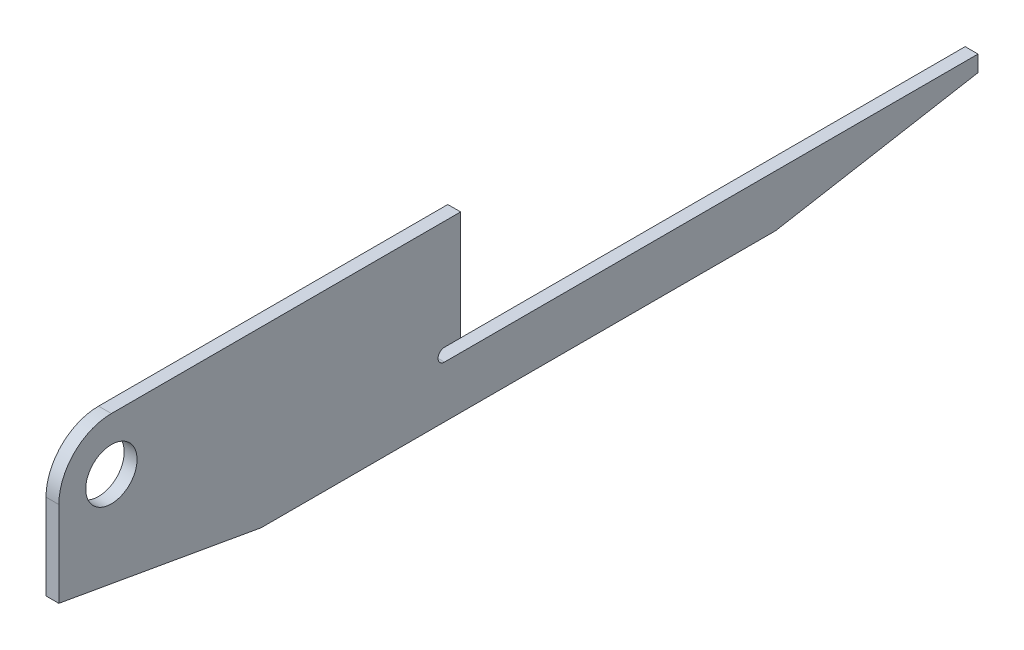
ISO-10303-21;
HEADER;
FILE_DESCRIPTION(('STEP AP214'),'2;1');
FILE_NAME('part.step','',(''),(''),'','','');
FILE_SCHEMA(('AUTOMOTIVE_DESIGN { 1 0 10303 214 1 1 1 1 }'));
ENDSEC;
DATA;
#1=APPLICATION_CONTEXT('core data for automotive mechanical design processes');
#2=APPLICATION_PROTOCOL_DEFINITION('international standard','automotive_design',2000,#1);
#3=PRODUCT_CONTEXT('',#1,'mechanical');
#4=PRODUCT('Part','Part','',(#3));
#5=PRODUCT_RELATED_PRODUCT_CATEGORY('part','',(#4));
#6=PRODUCT_DEFINITION_FORMATION('','',#4);
#7=PRODUCT_DEFINITION_CONTEXT('part definition',#1,'design');
#8=PRODUCT_DEFINITION('design','',#6,#7);
#9=PRODUCT_DEFINITION_SHAPE('','',#8);
#10=(LENGTH_UNIT() NAMED_UNIT(*) SI_UNIT(.MILLI.,.METRE.));
#11=(NAMED_UNIT(*) PLANE_ANGLE_UNIT() SI_UNIT($,.RADIAN.));
#12=(NAMED_UNIT(*) SI_UNIT($,.STERADIAN.) SOLID_ANGLE_UNIT());
#13=UNCERTAINTY_MEASURE_WITH_UNIT(LENGTH_MEASURE(1.E-05),#10,'distance_accuracy_value','');
#14=(GEOMETRIC_REPRESENTATION_CONTEXT(3) GLOBAL_UNCERTAINTY_ASSIGNED_CONTEXT((#13)) GLOBAL_UNIT_ASSIGNED_CONTEXT((#10,
#11,#12)) REPRESENTATION_CONTEXT('',''));
#15=CARTESIAN_POINT('',(0.,0.,0.));
#16=DIRECTION('',(0.,0.,1.));
#17=DIRECTION('',(1.,0.,0.));
#18=AXIS2_PLACEMENT_3D('',#15,#16,#17);
#19=CARTESIAN_POINT('',(0.79375,-145.4,0.));
#20=DIRECTION('',(-1.,0.,0.));
#21=DIRECTION('',(0.,0.,1.));
#22=AXIS2_PLACEMENT_3D('',#19,#20,#21);
#23=PLANE('',#22);
#24=CARTESIAN_POINT('',(0.79375,-145.4,0.));
#25=DIRECTION('',(1.,0.,0.));
#26=DIRECTION('',(0.,0.,1.));
#27=AXIS2_PLACEMENT_3D('',#24,#25,#26);
#28=CIRCLE('',#27,6.5);
#29=CARTESIAN_POINT('',(0.79375,-138.9,0.));
#30=VERTEX_POINT('',#29);
#31=CARTESIAN_POINT('',(0.79375,-145.4,6.5));
#32=VERTEX_POINT('',#31);
#33=EDGE_CURVE('E182',#30,#32,#28,.T.);
#34=ORIENTED_EDGE('',*,*,#33,.T.);
#35=DIRECTION('',(0.,-1.,0.));
#36=VECTOR('',#35,1.);
#37=CARTESIAN_POINT('',(0.79375,-155.9875,6.5));
#38=LINE('',#37,#36);
#39=CARTESIAN_POINT('',(0.79375,-155.9875,6.5));
#40=VERTEX_POINT('',#39);
#41=EDGE_CURVE('E111',#32,#40,#38,.T.);
#42=ORIENTED_EDGE('',*,*,#41,.T.);
#43=DIRECTION('',(0.,-0.173648177666923,-0.984807753012209));
#44=VECTOR('',#43,1.);
#45=CARTESIAN_POINT('',(0.79375,-160.4,-18.5245310290642));
#46=LINE('',#45,#44);
#47=CARTESIAN_POINT('',(0.79375,-160.4,-18.5245310290642));
#48=VERTEX_POINT('',#47);
#49=EDGE_CURVE('E202',#40,#48,#46,.T.);
#50=ORIENTED_EDGE('',*,*,#49,.T.);
#51=DIRECTION('',(0.,0.,-1.));
#52=VECTOR('',#51,1.);
#53=CARTESIAN_POINT('',(0.79375,-160.4,-82.1754689709358));
#54=LINE('',#53,#52);
#55=CARTESIAN_POINT('',(0.79375,-160.4,-82.1754689709358));
#56=VERTEX_POINT('',#55);
#57=EDGE_CURVE('E221',#48,#56,#54,.T.);
#58=ORIENTED_EDGE('',*,*,#57,.T.);
#59=DIRECTION('',(0.,0.173648177666924,-0.984807753012209));
#60=VECTOR('',#59,1.);
#61=CARTESIAN_POINT('',(0.79375,-155.9875,-107.2));
#62=LINE('',#61,#60);
#63=CARTESIAN_POINT('',(0.79375,-155.9875,-107.2));
#64=VERTEX_POINT('',#63);
#65=EDGE_CURVE('E222',#56,#64,#62,.T.);
#66=ORIENTED_EDGE('',*,*,#65,.T.);
#67=DIRECTION('',(0.,1.,0.));
#68=VECTOR('',#67,1.);
#69=CARTESIAN_POINT('',(0.79375,-153.9875,-107.2));
#70=LINE('',#69,#68);
#71=CARTESIAN_POINT('',(0.79375,-153.9875,-107.2));
#72=VERTEX_POINT('',#71);
#73=EDGE_CURVE('E224',#64,#72,#70,.T.);
#74=ORIENTED_EDGE('',*,*,#73,.T.);
#75=DIRECTION('',(0.,0.,1.));
#76=VECTOR('',#75,1.);
#77=CARTESIAN_POINT('',(0.79375,-153.9875,-41.2));
#78=LINE('',#77,#76);
#79=CARTESIAN_POINT('',(0.79375,-153.9875,-41.2));
#80=VERTEX_POINT('',#79);
#81=EDGE_CURVE('E227',#72,#80,#78,.T.);
#82=ORIENTED_EDGE('',*,*,#81,.T.);
#83=CARTESIAN_POINT('',(0.79375,-153.19375,-41.2));
#84=DIRECTION('',(-1.,0.,0.));
#85=DIRECTION('',(0.,0.,-1.));
#86=AXIS2_PLACEMENT_3D('',#83,#84,#85);
#87=CIRCLE('',#86,0.793749999999982);
#88=CARTESIAN_POINT('',(0.79375,-152.4,-41.2));
#89=VERTEX_POINT('',#88);
#90=EDGE_CURVE('E142',#80,#89,#87,.T.);
#91=ORIENTED_EDGE('',*,*,#90,.T.);
#92=DIRECTION('',(0.,0.,-1.));
#93=VECTOR('',#92,1.);
#94=CARTESIAN_POINT('',(0.79375,-152.4,-43.2));
#95=LINE('',#94,#93);
#96=CARTESIAN_POINT('',(0.79375,-152.4,-43.2));
#97=VERTEX_POINT('',#96);
#98=EDGE_CURVE('E137',#89,#97,#95,.T.);
#99=ORIENTED_EDGE('',*,*,#98,.T.);
#100=DIRECTION('',(0.,1.,0.));
#101=VECTOR('',#100,1.);
#102=CARTESIAN_POINT('',(0.79375,-138.9,-43.2));
#103=LINE('',#102,#101);
#104=CARTESIAN_POINT('',(0.79375,-138.9,-43.2));
#105=VERTEX_POINT('',#104);
#106=EDGE_CURVE('E138',#97,#105,#103,.T.);
#107=ORIENTED_EDGE('',*,*,#106,.T.);
#108=DIRECTION('',(0.,0.,1.));
#109=VECTOR('',#108,1.);
#110=CARTESIAN_POINT('',(0.79375,-138.9,0.));
#111=LINE('',#110,#109);
#112=EDGE_CURVE('E65',#105,#30,#111,.T.);
#113=ORIENTED_EDGE('',*,*,#112,.T.);
#114=EDGE_LOOP('',(#34,#42,#50,#58,#66,#74,#82,#91,#99,#107,#113));
#115=FACE_BOUND('',#114,.T.);
#116=CARTESIAN_POINT('',(0.79375,-145.4,0.));
#117=DIRECTION('',(1.,0.,0.));
#118=DIRECTION('',(0.,0.,-1.));
#119=AXIS2_PLACEMENT_3D('',#116,#117,#118);
#120=CIRCLE('',#119,3.175);
#121=CARTESIAN_POINT('',(0.79375,-145.4,-3.175));
#122=VERTEX_POINT('',#121);
#123=EDGE_CURVE('E163',#122,#122,#120,.T.);
#124=ORIENTED_EDGE('',*,*,#123,.F.);
#125=EDGE_LOOP('',(#124));
#126=FACE_BOUND('',#125,.T.);
#127=ADVANCED_FACE('F44',(#115,#126),#23,.F.);
#128=CARTESIAN_POINT('',(-0.79375,-145.4,0.));
#129=DIRECTION('',(-1.,0.,0.));
#130=DIRECTION('',(0.,0.,1.));
#131=AXIS2_PLACEMENT_3D('',#128,#129,#130);
#132=PLANE('',#131);
#133=CARTESIAN_POINT('',(-0.79375,-145.4,0.));
#134=DIRECTION('',(1.,0.,0.));
#135=DIRECTION('',(0.,0.,1.));
#136=AXIS2_PLACEMENT_3D('',#133,#134,#135);
#137=CIRCLE('',#136,6.5);
#138=CARTESIAN_POINT('',(-0.79375,-138.9,0.));
#139=VERTEX_POINT('',#138);
#140=CARTESIAN_POINT('',(-0.79375,-145.4,6.5));
#141=VERTEX_POINT('',#140);
#142=EDGE_CURVE('E159',#139,#141,#137,.T.);
#143=ORIENTED_EDGE('',*,*,#142,.F.);
#144=DIRECTION('',(0.,0.,1.));
#145=VECTOR('',#144,1.);
#146=CARTESIAN_POINT('',(-0.79375,-138.9,0.));
#147=LINE('',#146,#145);
#148=CARTESIAN_POINT('',(-0.79375,-138.9,-43.2));
#149=VERTEX_POINT('',#148);
#150=EDGE_CURVE('E106',#149,#139,#147,.T.);
#151=ORIENTED_EDGE('',*,*,#150,.F.);
#152=DIRECTION('',(0.,1.,0.));
#153=VECTOR('',#152,1.);
#154=CARTESIAN_POINT('',(-0.79375,-138.9,-43.2));
#155=LINE('',#154,#153);
#156=CARTESIAN_POINT('',(-0.79375,-152.4,-43.2));
#157=VERTEX_POINT('',#156);
#158=EDGE_CURVE('E99',#157,#149,#155,.T.);
#159=ORIENTED_EDGE('',*,*,#158,.F.);
#160=DIRECTION('',(0.,0.,-1.));
#161=VECTOR('',#160,1.);
#162=CARTESIAN_POINT('',(-0.79375,-152.4,-43.2));
#163=LINE('',#162,#161);
#164=CARTESIAN_POINT('',(-0.79375,-152.4,-41.2));
#165=VERTEX_POINT('',#164);
#166=EDGE_CURVE('E147',#165,#157,#163,.T.);
#167=ORIENTED_EDGE('',*,*,#166,.F.);
#168=CARTESIAN_POINT('',(-0.79375,-153.19375,-41.2));
#169=DIRECTION('',(-1.,0.,0.));
#170=DIRECTION('',(0.,0.,-1.));
#171=AXIS2_PLACEMENT_3D('',#168,#169,#170);
#172=CIRCLE('',#171,0.793749999999982);
#173=CARTESIAN_POINT('',(-0.79375,-153.9875,-41.2));
#174=VERTEX_POINT('',#173);
#175=EDGE_CURVE('E177',#174,#165,#172,.T.);
#176=ORIENTED_EDGE('',*,*,#175,.F.);
#177=DIRECTION('',(0.,0.,1.));
#178=VECTOR('',#177,1.);
#179=CARTESIAN_POINT('',(-0.79375,-153.9875,-41.2));
#180=LINE('',#179,#178);
#181=CARTESIAN_POINT('',(-0.79375,-153.9875,-107.2));
#182=VERTEX_POINT('',#181);
#183=EDGE_CURVE('E171',#182,#174,#180,.T.);
#184=ORIENTED_EDGE('',*,*,#183,.F.);
#185=DIRECTION('',(0.,1.,0.));
#186=VECTOR('',#185,1.);
#187=CARTESIAN_POINT('',(-0.79375,-153.9875,-107.2));
#188=LINE('',#187,#186);
#189=CARTESIAN_POINT('',(-0.79375,-155.9875,-107.2));
#190=VERTEX_POINT('',#189);
#191=EDGE_CURVE('E175',#190,#182,#188,.T.);
#192=ORIENTED_EDGE('',*,*,#191,.F.);
#193=DIRECTION('',(0.,0.173648177666924,-0.984807753012209));
#194=VECTOR('',#193,1.);
#195=CARTESIAN_POINT('',(-0.79375,-155.9875,-107.2));
#196=LINE('',#195,#194);
#197=CARTESIAN_POINT('',(-0.79375,-160.4,-82.1754689709358));
#198=VERTEX_POINT('',#197);
#199=EDGE_CURVE('E168',#198,#190,#196,.T.);
#200=ORIENTED_EDGE('',*,*,#199,.F.);
#201=DIRECTION('',(0.,0.,-1.));
#202=VECTOR('',#201,1.);
#203=CARTESIAN_POINT('',(-0.79375,-160.4,-82.1754689709358));
#204=LINE('',#203,#202);
#205=CARTESIAN_POINT('',(-0.79375,-160.4,-18.5245310290642));
#206=VERTEX_POINT('',#205);
#207=EDGE_CURVE('E169',#206,#198,#204,.T.);
#208=ORIENTED_EDGE('',*,*,#207,.F.);
#209=DIRECTION('',(0.,-0.173648177666923,-0.984807753012209));
#210=VECTOR('',#209,1.);
#211=CARTESIAN_POINT('',(-0.79375,-160.4,-18.5245310290642));
#212=LINE('',#211,#210);
#213=CARTESIAN_POINT('',(-0.79375,-155.9875,6.5));
#214=VERTEX_POINT('',#213);
#215=EDGE_CURVE('E167',#214,#206,#212,.T.);
#216=ORIENTED_EDGE('',*,*,#215,.F.);
#217=DIRECTION('',(0.,-1.,0.));
#218=VECTOR('',#217,1.);
#219=CARTESIAN_POINT('',(-0.79375,-155.9875,6.5));
#220=LINE('',#219,#218);
#221=EDGE_CURVE('E162',#141,#214,#220,.T.);
#222=ORIENTED_EDGE('',*,*,#221,.F.);
#223=EDGE_LOOP('',(#143,#151,#159,#167,#176,#184,#192,#200,#208,#216,#222));
#224=FACE_BOUND('',#223,.T.);
#225=CARTESIAN_POINT('',(-0.79375,-145.4,0.));
#226=DIRECTION('',(1.,0.,0.));
#227=DIRECTION('',(0.,0.,-1.));
#228=AXIS2_PLACEMENT_3D('',#225,#226,#227);
#229=CIRCLE('',#228,3.175);
#230=CARTESIAN_POINT('',(-0.79375,-145.4,-3.175));
#231=VERTEX_POINT('',#230);
#232=EDGE_CURVE('E419',#231,#231,#229,.T.);
#233=ORIENTED_EDGE('',*,*,#232,.T.);
#234=EDGE_LOOP('',(#233));
#235=FACE_BOUND('',#234,.T.);
#236=ADVANCED_FACE('F207',(#224,#235),#132,.T.);
#237=CARTESIAN_POINT('',(0.79375,-145.4,0.));
#238=DIRECTION('',(-1.,0.,0.));
#239=DIRECTION('',(0.,0.,1.));
#240=AXIS2_PLACEMENT_3D('',#237,#238,#239);
#241=CYLINDRICAL_SURFACE('',#240,6.5);
#242=ORIENTED_EDGE('',*,*,#142,.T.);
#243=DIRECTION('',(-1.,0.,0.));
#244=VECTOR('',#243,1.);
#245=CARTESIAN_POINT('',(0.79375,-145.4,6.5));
#246=LINE('',#245,#244);
#247=EDGE_CURVE('E11',#32,#141,#246,.T.);
#248=ORIENTED_EDGE('',*,*,#247,.F.);
#249=ORIENTED_EDGE('',*,*,#33,.F.);
#250=DIRECTION('',(-1.,0.,0.));
#251=VECTOR('',#250,1.);
#252=CARTESIAN_POINT('',(0.79375,-138.9,0.));
#253=LINE('',#252,#251);
#254=EDGE_CURVE('E156',#30,#139,#253,.T.);
#255=ORIENTED_EDGE('',*,*,#254,.T.);
#256=EDGE_LOOP('',(#242,#248,#249,#255));
#257=FACE_BOUND('',#256,.T.);
#258=ADVANCED_FACE('F50',(#257),#241,.T.);
#259=CARTESIAN_POINT('',(0.79375,-155.9875,6.5));
#260=DIRECTION('',(0.,0.,-1.));
#261=DIRECTION('',(0.,1.,0.));
#262=AXIS2_PLACEMENT_3D('',#259,#260,#261);
#263=PLANE('',#262);
#264=ORIENTED_EDGE('',*,*,#221,.T.);
#265=DIRECTION('',(-1.,0.,0.));
#266=VECTOR('',#265,1.);
#267=CARTESIAN_POINT('',(0.79375,-155.9875,6.5));
#268=LINE('',#267,#266);
#269=EDGE_CURVE('E53',#40,#214,#268,.T.);
#270=ORIENTED_EDGE('',*,*,#269,.F.);
#271=ORIENTED_EDGE('',*,*,#41,.F.);
#272=ORIENTED_EDGE('',*,*,#247,.T.);
#273=EDGE_LOOP('',(#264,#270,#271,#272));
#274=FACE_BOUND('',#273,.T.);
#275=ADVANCED_FACE('F263',(#274),#263,.F.);
#276=CARTESIAN_POINT('',(0.79375,-160.4,-18.5245310290642));
#277=DIRECTION('',(0.,0.984807753012209,-0.173648177666923));
#278=DIRECTION('',(0.,0.173648177666923,0.98480775301221));
#279=AXIS2_PLACEMENT_3D('',#276,#277,#278);
#280=PLANE('',#279);
#281=ORIENTED_EDGE('',*,*,#215,.T.);
#282=DIRECTION('',(-1.,0.,0.));
#283=VECTOR('',#282,1.);
#284=CARTESIAN_POINT('',(0.79375,-160.4,-18.5245310290642));
#285=LINE('',#284,#283);
#286=EDGE_CURVE('E197',#48,#206,#285,.T.);
#287=ORIENTED_EDGE('',*,*,#286,.F.);
#288=ORIENTED_EDGE('',*,*,#49,.F.);
#289=ORIENTED_EDGE('',*,*,#269,.T.);
#290=EDGE_LOOP('',(#281,#287,#288,#289));
#291=FACE_BOUND('',#290,.T.);
#292=ADVANCED_FACE('F201',(#291),#280,.F.);
#293=CARTESIAN_POINT('',(0.79375,-160.4,-82.1754689709358));
#294=DIRECTION('',(0.,1.,0.));
#295=DIRECTION('',(0.,0.,1.));
#296=AXIS2_PLACEMENT_3D('',#293,#294,#295);
#297=PLANE('',#296);
#298=ORIENTED_EDGE('',*,*,#207,.T.);
#299=DIRECTION('',(-1.,0.,0.));
#300=VECTOR('',#299,1.);
#301=CARTESIAN_POINT('',(0.79375,-160.4,-82.1754689709358));
#302=LINE('',#301,#300);
#303=EDGE_CURVE('E191',#56,#198,#302,.T.);
#304=ORIENTED_EDGE('',*,*,#303,.F.);
#305=ORIENTED_EDGE('',*,*,#57,.F.);
#306=ORIENTED_EDGE('',*,*,#286,.T.);
#307=EDGE_LOOP('',(#298,#304,#305,#306));
#308=FACE_BOUND('',#307,.T.);
#309=ADVANCED_FACE('F214',(#308),#297,.F.);
#310=CARTESIAN_POINT('',(0.79375,-155.9875,-107.2));
#311=DIRECTION('',(0.,0.984807753012209,0.173648177666924));
#312=DIRECTION('',(0.,-0.173648177666924,0.984807753012209));
#313=AXIS2_PLACEMENT_3D('',#310,#311,#312);
#314=PLANE('',#313);
#315=ORIENTED_EDGE('',*,*,#199,.T.);
#316=DIRECTION('',(-1.,0.,0.));
#317=VECTOR('',#316,1.);
#318=CARTESIAN_POINT('',(0.79375,-155.9875,-107.2));
#319=LINE('',#318,#317);
#320=EDGE_CURVE('E192',#64,#190,#319,.T.);
#321=ORIENTED_EDGE('',*,*,#320,.F.);
#322=ORIENTED_EDGE('',*,*,#65,.F.);
#323=ORIENTED_EDGE('',*,*,#303,.T.);
#324=EDGE_LOOP('',(#315,#321,#322,#323));
#325=FACE_BOUND('',#324,.T.);
#326=ADVANCED_FACE('F218',(#325),#314,.F.);
#327=CARTESIAN_POINT('',(0.79375,-153.9875,-107.2));
#328=DIRECTION('',(0.,0.,1.));
#329=DIRECTION('',(1.,0.,0.));
#330=AXIS2_PLACEMENT_3D('',#327,#328,#329);
#331=PLANE('',#330);
#332=ORIENTED_EDGE('',*,*,#191,.T.);
#333=DIRECTION('',(-1.,0.,0.));
#334=VECTOR('',#333,1.);
#335=CARTESIAN_POINT('',(0.79375,-153.9875,-107.2));
#336=LINE('',#335,#334);
#337=EDGE_CURVE('E189',#72,#182,#336,.T.);
#338=ORIENTED_EDGE('',*,*,#337,.F.);
#339=ORIENTED_EDGE('',*,*,#73,.F.);
#340=ORIENTED_EDGE('',*,*,#320,.T.);
#341=EDGE_LOOP('',(#332,#338,#339,#340));
#342=FACE_BOUND('',#341,.T.);
#343=ADVANCED_FACE('F277',(#342),#331,.F.);
#344=CARTESIAN_POINT('',(0.79375,-153.9875,-41.2));
#345=DIRECTION('',(0.,-1.,0.));
#346=DIRECTION('',(0.,0.,-1.));
#347=AXIS2_PLACEMENT_3D('',#344,#345,#346);
#348=PLANE('',#347);
#349=ORIENTED_EDGE('',*,*,#183,.T.);
#350=DIRECTION('',(-1.,0.,0.));
#351=VECTOR('',#350,1.);
#352=CARTESIAN_POINT('',(0.79375,-153.9875,-41.2));
#353=LINE('',#352,#351);
#354=EDGE_CURVE('E183',#80,#174,#353,.T.);
#355=ORIENTED_EDGE('',*,*,#354,.F.);
#356=ORIENTED_EDGE('',*,*,#81,.F.);
#357=ORIENTED_EDGE('',*,*,#337,.T.);
#358=EDGE_LOOP('',(#349,#355,#356,#357));
#359=FACE_BOUND('',#358,.T.);
#360=ADVANCED_FACE('F233',(#359),#348,.F.);
#361=CARTESIAN_POINT('',(0.79375,-153.19375,-41.2));
#362=DIRECTION('',(-1.,0.,0.));
#363=DIRECTION('',(0.,0.,1.));
#364=AXIS2_PLACEMENT_3D('',#361,#362,#363);
#365=CYLINDRICAL_SURFACE('',#364,0.793749999999982);
#366=ORIENTED_EDGE('',*,*,#175,.T.);
#367=DIRECTION('',(-1.,0.,0.));
#368=VECTOR('',#367,1.);
#369=CARTESIAN_POINT('',(0.79375,-152.4,-41.2));
#370=LINE('',#369,#368);
#371=EDGE_CURVE('E151',#89,#165,#370,.T.);
#372=ORIENTED_EDGE('',*,*,#371,.F.);
#373=ORIENTED_EDGE('',*,*,#90,.F.);
#374=ORIENTED_EDGE('',*,*,#354,.T.);
#375=EDGE_LOOP('',(#366,#372,#373,#374));
#376=FACE_BOUND('',#375,.T.);
#377=ADVANCED_FACE('F239',(#376),#365,.F.);
#378=CARTESIAN_POINT('',(0.79375,-152.4,-43.2));
#379=DIRECTION('',(0.,1.,0.));
#380=DIRECTION('',(0.,0.,1.));
#381=AXIS2_PLACEMENT_3D('',#378,#379,#380);
#382=PLANE('',#381);
#383=ORIENTED_EDGE('',*,*,#166,.T.);
#384=DIRECTION('',(-1.,0.,0.));
#385=VECTOR('',#384,1.);
#386=CARTESIAN_POINT('',(0.79375,-152.4,-43.2));
#387=LINE('',#386,#385);
#388=EDGE_CURVE('E150',#97,#157,#387,.T.);
#389=ORIENTED_EDGE('',*,*,#388,.F.);
#390=ORIENTED_EDGE('',*,*,#98,.F.);
#391=ORIENTED_EDGE('',*,*,#371,.T.);
#392=EDGE_LOOP('',(#383,#389,#390,#391));
#393=FACE_BOUND('',#392,.T.);
#394=ADVANCED_FACE('F146',(#393),#382,.F.);
#395=CARTESIAN_POINT('',(0.79375,-138.9,-43.2));
#396=DIRECTION('',(0.,0.,1.));
#397=DIRECTION('',(1.,0.,0.));
#398=AXIS2_PLACEMENT_3D('',#395,#396,#397);
#399=PLANE('',#398);
#400=ORIENTED_EDGE('',*,*,#158,.T.);
#401=DIRECTION('',(-1.,0.,0.));
#402=VECTOR('',#401,1.);
#403=CARTESIAN_POINT('',(0.79375,-138.9,-43.2));
#404=LINE('',#403,#402);
#405=EDGE_CURVE('E155',#105,#149,#404,.T.);
#406=ORIENTED_EDGE('',*,*,#405,.F.);
#407=ORIENTED_EDGE('',*,*,#106,.F.);
#408=ORIENTED_EDGE('',*,*,#388,.T.);
#409=EDGE_LOOP('',(#400,#406,#407,#408));
#410=FACE_BOUND('',#409,.T.);
#411=ADVANCED_FACE('F152',(#410),#399,.F.);
#412=CARTESIAN_POINT('',(0.79375,-138.9,0.));
#413=DIRECTION('',(0.,-1.,0.));
#414=DIRECTION('',(0.,0.,-1.));
#415=AXIS2_PLACEMENT_3D('',#412,#413,#414);
#416=PLANE('',#415);
#417=ORIENTED_EDGE('',*,*,#150,.T.);
#418=ORIENTED_EDGE('',*,*,#254,.F.);
#419=ORIENTED_EDGE('',*,*,#112,.F.);
#420=ORIENTED_EDGE('',*,*,#405,.T.);
#421=EDGE_LOOP('',(#417,#418,#419,#420));
#422=FACE_BOUND('',#421,.T.);
#423=ADVANCED_FACE('F244',(#422),#416,.F.);
#424=CARTESIAN_POINT('',(0.79375,-145.4,0.));
#425=DIRECTION('',(-1.,0.,0.));
#426=DIRECTION('',(0.,0.,1.));
#427=AXIS2_PLACEMENT_3D('',#424,#425,#426);
#428=CYLINDRICAL_SURFACE('',#427,3.175);
#429=ORIENTED_EDGE('',*,*,#123,.T.);
#430=EDGE_LOOP('',(#429));
#431=FACE_BOUND('',#430,.T.);
#432=ORIENTED_EDGE('',*,*,#232,.F.);
#433=EDGE_LOOP('',(#432));
#434=FACE_BOUND('',#433,.T.);
#435=ADVANCED_FACE('F243',(#431,#434),#428,.F.);
#436=CLOSED_SHELL('',(#127,#236,#258,#275,#292,#309,#326,#343,#360,#377,#394,#411,#423,#435));
#437=MANIFOLD_SOLID_BREP('B2',#436);
#438=ADVANCED_BREP_SHAPE_REPRESENTATION('',(#18,#437),#14);
#439=SHAPE_DEFINITION_REPRESENTATION(#9,#438);
ENDSEC;
END-ISO-10303-21;
